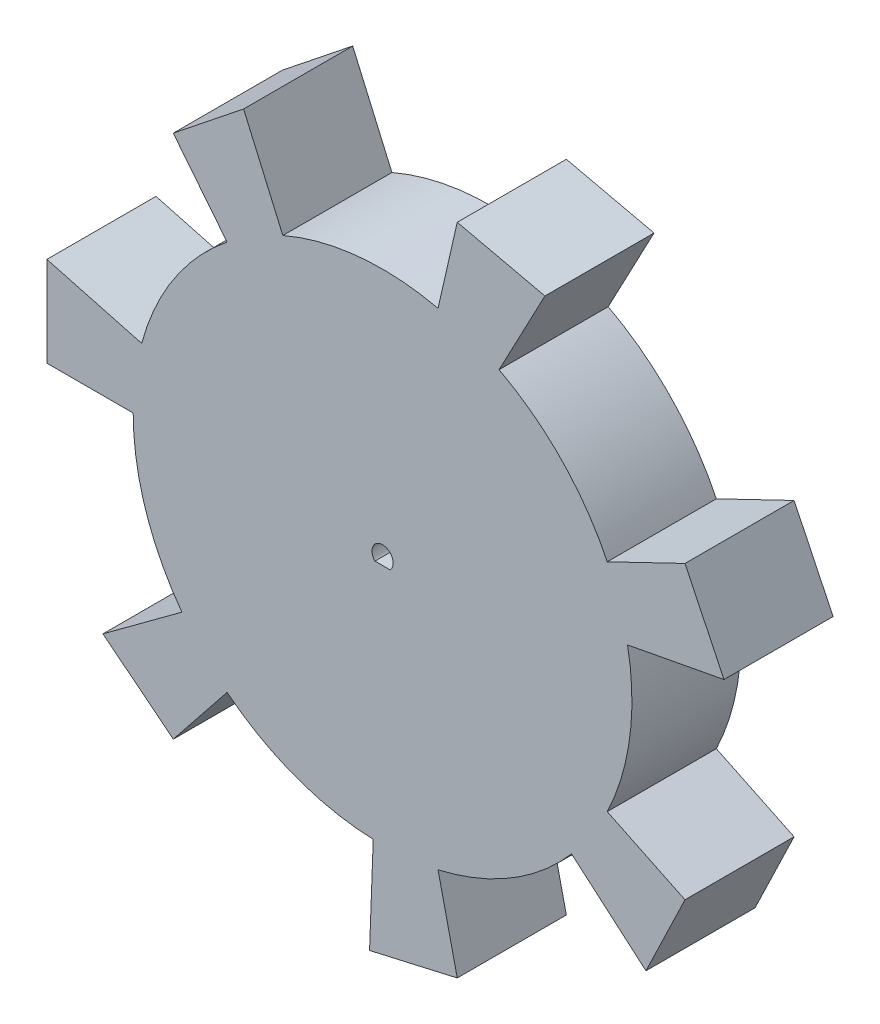
ISO-10303-21;
HEADER;
FILE_DESCRIPTION(('STEP AP214'),'2;1');
FILE_NAME('part.step','',(''),(''),'','','');
FILE_SCHEMA(('AUTOMOTIVE_DESIGN { 1 0 10303 214 1 1 1 1 }'));
ENDSEC;
DATA;
#1=APPLICATION_CONTEXT('core data for automotive mechanical design processes');
#2=APPLICATION_PROTOCOL_DEFINITION('international standard','automotive_design',2000,#1);
#3=PRODUCT_CONTEXT('',#1,'mechanical');
#4=PRODUCT('Part','Part','',(#3));
#5=PRODUCT_RELATED_PRODUCT_CATEGORY('part','',(#4));
#6=PRODUCT_DEFINITION_FORMATION('','',#4);
#7=PRODUCT_DEFINITION_CONTEXT('part definition',#1,'design');
#8=PRODUCT_DEFINITION('design','',#6,#7);
#9=PRODUCT_DEFINITION_SHAPE('','',#8);
#10=(LENGTH_UNIT() NAMED_UNIT(*) SI_UNIT(.MILLI.,.METRE.));
#11=(NAMED_UNIT(*) PLANE_ANGLE_UNIT() SI_UNIT($,.RADIAN.));
#12=(NAMED_UNIT(*) SI_UNIT($,.STERADIAN.) SOLID_ANGLE_UNIT());
#13=UNCERTAINTY_MEASURE_WITH_UNIT(LENGTH_MEASURE(1.E-05),#10,'distance_accuracy_value','');
#14=(GEOMETRIC_REPRESENTATION_CONTEXT(3) GLOBAL_UNCERTAINTY_ASSIGNED_CONTEXT((#13)) GLOBAL_UNIT_ASSIGNED_CONTEXT((#10,
#11,#12)) REPRESENTATION_CONTEXT('',''));
#15=CARTESIAN_POINT('',(0.,0.,0.));
#16=DIRECTION('',(0.,0.,1.));
#17=DIRECTION('',(1.,0.,0.));
#18=AXIS2_PLACEMENT_3D('',#15,#16,#17);
#19=CARTESIAN_POINT('',(0.,0.,17.5));
#20=DIRECTION('',(0.,0.,-1.));
#21=DIRECTION('',(-1.,0.,0.));
#22=AXIS2_PLACEMENT_3D('',#19,#20,#21);
#23=CYLINDRICAL_SURFACE('',#22,40.);
#24=CARTESIAN_POINT('',(0.,0.,0.));
#25=DIRECTION('',(0.,0.,1.));
#26=DIRECTION('',(1.,0.,0.));
#27=AXIS2_PLACEMENT_3D('',#24,#25,#26);
#28=CIRCLE('',#27,40.);
#29=CARTESIAN_POINT('',(36.0387547160991,-17.3553495647034,0.));
#30=VERTEX_POINT('',#29);
#31=CARTESIAN_POINT('',(39.3026589293317,7.43646428651689,0.));
#32=VERTEX_POINT('',#31);
#33=EDGE_CURVE('E258',#30,#32,#28,.T.);
#34=ORIENTED_EDGE('',*,*,#33,.T.);
#35=DIRECTION('',(0.,0.,-1.));
#36=VECTOR('',#35,1.);
#37=CARTESIAN_POINT('',(39.3026589293317,7.43646428651689,17.5));
#38=LINE('',#37,#36);
#39=CARTESIAN_POINT('',(39.3026589293317,7.43646428651689,17.5));
#40=VERTEX_POINT('',#39);
#41=EDGE_CURVE('E529',#40,#32,#38,.T.);
#42=ORIENTED_EDGE('',*,*,#41,.F.);
#43=CARTESIAN_POINT('',(0.,0.,17.5));
#44=DIRECTION('',(0.,0.,1.));
#45=DIRECTION('',(1.,0.,0.));
#46=AXIS2_PLACEMENT_3D('',#43,#44,#45);
#47=CIRCLE('',#46,40.);
#48=CARTESIAN_POINT('',(36.0387547160991,-17.3553495647034,17.5));
#49=VERTEX_POINT('',#48);
#50=EDGE_CURVE('E262',#49,#40,#47,.T.);
#51=ORIENTED_EDGE('',*,*,#50,.F.);
#52=DIRECTION('',(0.,0.,-1.));
#53=VECTOR('',#52,1.);
#54=CARTESIAN_POINT('',(36.0387547160991,-17.3553495647034,17.5));
#55=LINE('',#54,#53);
#56=EDGE_CURVE('E356',#49,#30,#55,.T.);
#57=ORIENTED_EDGE('',*,*,#56,.T.);
#58=EDGE_LOOP('',(#34,#42,#51,#57));
#59=FACE_BOUND('',#58,.T.);
#60=ADVANCED_FACE('F39',(#59),#23,.T.);
#61=CARTESIAN_POINT('',(0.,0.,17.5));
#62=DIRECTION('',(0.185911607162921,-0.982566473233287,0.));
#63=DIRECTION('',(0.982566473233287,0.185911607162921,0.));
#64=AXIS2_PLACEMENT_3D('',#61,#62,#63);
#65=PLANE('',#64);
#66=DIRECTION('',(-0.982566473233287,-0.185911607162921,0.));
#67=VECTOR('',#66,1.);
#68=CARTESIAN_POINT('',(0.,0.,0.));
#69=LINE('',#68,#67);
#70=CARTESIAN_POINT('',(54.7692080260714,10.3628932642804,0.));
#71=VERTEX_POINT('',#70);
#72=EDGE_CURVE('E360',#71,#32,#69,.T.);
#73=ORIENTED_EDGE('',*,*,#72,.F.);
#74=DIRECTION('',(0.,0.,-1.));
#75=VECTOR('',#74,1.);
#76=CARTESIAN_POINT('',(54.7692080260714,10.3628932642804,17.5));
#77=LINE('',#76,#75);
#78=CARTESIAN_POINT('',(54.7692080260714,10.3628932642804,17.5));
#79=VERTEX_POINT('',#78);
#80=EDGE_CURVE('E526',#79,#71,#77,.T.);
#81=ORIENTED_EDGE('',*,*,#80,.F.);
#82=DIRECTION('',(-0.982566473233287,-0.185911607162921,0.));
#83=VECTOR('',#82,1.);
#84=CARTESIAN_POINT('',(0.,0.,17.5));
#85=LINE('',#84,#83);
#86=EDGE_CURVE('E265',#79,#40,#85,.T.);
#87=ORIENTED_EDGE('',*,*,#86,.T.);
#88=ORIENTED_EDGE('',*,*,#41,.T.);
#89=EDGE_LOOP('',(#73,#81,#87,#88));
#90=FACE_BOUND('',#89,.T.);
#91=ADVANCED_FACE('F41',(#90),#65,.T.);
#92=CARTESIAN_POINT('',(48.5096434448383,23.3610130504372,17.5));
#93=DIRECTION('',(0.900968867902419,0.433883739117558,0.));
#94=DIRECTION('',(-0.433883739117559,0.900968867902419,0.));
#95=AXIS2_PLACEMENT_3D('',#92,#93,#94);
#96=PLANE('',#95);
#97=DIRECTION('',(0.433883739117559,-0.900968867902419,0.));
#98=VECTOR('',#97,1.);
#99=CARTESIAN_POINT('',(48.5096434448383,23.3610130504372,0.));
#100=LINE('',#99,#98);
#101=CARTESIAN_POINT('',(48.5096434448345,23.361013050445,0.));
#102=VERTEX_POINT('',#101);
#103=EDGE_CURVE('E366',#102,#71,#100,.T.);
#104=ORIENTED_EDGE('',*,*,#103,.F.);
#105=DIRECTION('',(0.,0.,-1.));
#106=VECTOR('',#105,1.);
#107=CARTESIAN_POINT('',(48.5096434448345,23.361013050445,17.5));
#108=LINE('',#107,#106);
#109=CARTESIAN_POINT('',(48.5096434448345,23.361013050445,17.5));
#110=VERTEX_POINT('',#109);
#111=EDGE_CURVE('E523',#110,#102,#108,.T.);
#112=ORIENTED_EDGE('',*,*,#111,.F.);
#113=DIRECTION('',(0.433883739117559,-0.900968867902419,0.));
#114=VECTOR('',#113,1.);
#115=CARTESIAN_POINT('',(48.5096434448383,23.3610130504372,17.5));
#116=LINE('',#115,#114);
#117=EDGE_CURVE('E272',#110,#79,#116,.T.);
#118=ORIENTED_EDGE('',*,*,#117,.T.);
#119=ORIENTED_EDGE('',*,*,#80,.T.);
#120=EDGE_LOOP('',(#104,#112,#118,#119));
#121=FACE_BOUND('',#120,.T.);
#122=ADVANCED_FACE('F559',(#121),#96,.T.);
#123=CARTESIAN_POINT('',(0.,0.,17.5));
#124=DIRECTION('',(-0.433883739117558,0.900968867902419,0.));
#125=DIRECTION('',(-0.900968867902419,-0.433883739117558,0.));
#126=AXIS2_PLACEMENT_3D('',#123,#124,#125);
#127=PLANE('',#126);
#128=DIRECTION('',(0.900968867902419,0.433883739117558,0.));
#129=VECTOR('',#128,1.);
#130=CARTESIAN_POINT('',(0.,0.,0.));
#131=LINE('',#130,#129);
#132=CARTESIAN_POINT('',(36.038754716097,17.3553495647024,0.));
#133=VERTEX_POINT('',#132);
#134=EDGE_CURVE('E370',#133,#102,#131,.T.);
#135=ORIENTED_EDGE('',*,*,#134,.F.);
#136=DIRECTION('',(0.,0.,-1.));
#137=VECTOR('',#136,1.);
#138=CARTESIAN_POINT('',(36.038754716097,17.3553495647024,17.5));
#139=LINE('',#138,#137);
#140=CARTESIAN_POINT('',(36.038754716097,17.3553495647024,17.5));
#141=VERTEX_POINT('',#140);
#142=EDGE_CURVE('E520',#141,#133,#139,.T.);
#143=ORIENTED_EDGE('',*,*,#142,.F.);
#144=DIRECTION('',(0.900968867902419,0.433883739117558,0.));
#145=VECTOR('',#144,1.);
#146=CARTESIAN_POINT('',(0.,0.,17.5));
#147=LINE('',#146,#145);
#148=EDGE_CURVE('E276',#141,#110,#147,.T.);
#149=ORIENTED_EDGE('',*,*,#148,.T.);
#150=ORIENTED_EDGE('',*,*,#111,.T.);
#151=EDGE_LOOP('',(#135,#143,#149,#150));
#152=FACE_BOUND('',#151,.T.);
#153=ADVANCED_FACE('F565',(#152),#127,.T.);
#154=CARTESIAN_POINT('',(18.6907451309242,35.3646157401882,0.));
#155=VERTEX_POINT('',#154);
#156=EDGE_CURVE('E362',#133,#155,#28,.T.);
#157=ORIENTED_EDGE('',*,*,#156,.T.);
#158=DIRECTION('',(0.,0.,-1.));
#159=VECTOR('',#158,1.);
#160=CARTESIAN_POINT('',(18.6907451309242,35.3646157401882,17.5));
#161=LINE('',#160,#159);
#162=CARTESIAN_POINT('',(18.6907451309242,35.3646157401882,17.5));
#163=VERTEX_POINT('',#162);
#164=EDGE_CURVE('E517',#163,#155,#161,.T.);
#165=ORIENTED_EDGE('',*,*,#164,.F.);
#166=EDGE_CURVE('E268',#141,#163,#47,.T.);
#167=ORIENTED_EDGE('',*,*,#166,.F.);
#168=ORIENTED_EDGE('',*,*,#142,.T.);
#169=EDGE_LOOP('',(#157,#165,#167,#168));
#170=FACE_BOUND('',#169,.T.);
#171=ADVANCED_FACE('F554',(#170),#23,.T.);
#172=CARTESIAN_POINT('',(0.,0.,17.5));
#173=DIRECTION('',(0.884115393504613,-0.467268628273056,0.));
#174=DIRECTION('',(0.467268628273056,0.884115393504613,0.));
#175=AXIS2_PLACEMENT_3D('',#172,#173,#174);
#176=PLANE('',#175);
#177=DIRECTION('',(-0.467268628273056,-0.884115393504613,0.));
#178=VECTOR('',#177,1.);
#179=CARTESIAN_POINT('',(0.,0.,0.));
#180=LINE('',#179,#178);
#181=CARTESIAN_POINT('',(26.046006456669,49.2814493726534,0.));
#182=VERTEX_POINT('',#181);
#183=EDGE_CURVE('E374',#182,#155,#180,.T.);
#184=ORIENTED_EDGE('',*,*,#183,.F.);
#185=DIRECTION('',(0.,0.,-1.));
#186=VECTOR('',#185,1.);
#187=CARTESIAN_POINT('',(26.046006456669,49.2814493726534,17.5));
#188=LINE('',#187,#186);
#189=CARTESIAN_POINT('',(26.046006456669,49.2814493726534,17.5));
#190=VERTEX_POINT('',#189);
#191=EDGE_CURVE('E514',#190,#182,#188,.T.);
#192=ORIENTED_EDGE('',*,*,#191,.F.);
#193=DIRECTION('',(-0.467268628273056,-0.884115393504613,0.));
#194=VECTOR('',#193,1.);
#195=CARTESIAN_POINT('',(0.,0.,17.5));
#196=LINE('',#195,#194);
#197=EDGE_CURVE('E280',#190,#163,#196,.T.);
#198=ORIENTED_EDGE('',*,*,#197,.T.);
#199=ORIENTED_EDGE('',*,*,#164,.T.);
#200=EDGE_LOOP('',(#184,#192,#198,#199));
#201=FACE_BOUND('',#200,.T.);
#202=ADVANCED_FACE('F564',(#201),#176,.T.);
#203=CARTESIAN_POINT('',(11.9808925144822,52.4917198465115,17.5));
#204=DIRECTION('',(0.222520933956315,0.974927912181824,0.));
#205=DIRECTION('',(-0.974927912181824,0.222520933956314,0.));
#206=AXIS2_PLACEMENT_3D('',#203,#204,#205);
#207=PLANE('',#206);
#208=DIRECTION('',(0.974927912181824,-0.222520933956315,0.));
#209=VECTOR('',#208,1.);
#210=CARTESIAN_POINT('',(11.9808925144822,52.4917198465115,0.));
#211=LINE('',#210,#209);
#212=CARTESIAN_POINT('',(11.9808925144776,52.4917198465125,0.));
#213=VERTEX_POINT('',#212);
#214=EDGE_CURVE('E378',#213,#182,#211,.T.);
#215=ORIENTED_EDGE('',*,*,#214,.F.);
#216=DIRECTION('',(0.,0.,-1.));
#217=VECTOR('',#216,1.);
#218=CARTESIAN_POINT('',(11.9808925144776,52.4917198465125,17.5));
#219=LINE('',#218,#217);
#220=CARTESIAN_POINT('',(11.9808925144776,52.4917198465125,17.5));
#221=VERTEX_POINT('',#220);
#222=EDGE_CURVE('E511',#221,#213,#219,.T.);
#223=ORIENTED_EDGE('',*,*,#222,.F.);
#224=DIRECTION('',(0.974927912181824,-0.222520933956315,0.));
#225=VECTOR('',#224,1.);
#226=CARTESIAN_POINT('',(11.9808925144822,52.4917198465115,17.5));
#227=LINE('',#226,#225);
#228=EDGE_CURVE('E284',#221,#190,#227,.T.);
#229=ORIENTED_EDGE('',*,*,#228,.T.);
#230=ORIENTED_EDGE('',*,*,#191,.T.);
#231=EDGE_LOOP('',(#215,#223,#229,#230));
#232=FACE_BOUND('',#231,.T.);
#233=ADVANCED_FACE('F636',(#232),#207,.T.);
#234=CARTESIAN_POINT('',(0.,0.,17.5));
#235=DIRECTION('',(-0.974927912181824,0.222520933956314,0.));
#236=DIRECTION('',(-0.222520933956314,-0.974927912181824,0.));
#237=AXIS2_PLACEMENT_3D('',#234,#235,#236);
#238=PLANE('',#237);
#239=DIRECTION('',(0.222520933956314,0.974927912181824,0.));
#240=VECTOR('',#239,1.);
#241=CARTESIAN_POINT('',(0.,0.,0.));
#242=LINE('',#241,#240);
#243=CARTESIAN_POINT('',(8.9008373582534,38.9971164872766,0.));
#244=VERTEX_POINT('',#243);
#245=EDGE_CURVE('E382',#244,#213,#242,.T.);
#246=ORIENTED_EDGE('',*,*,#245,.F.);
#247=DIRECTION('',(0.,0.,-1.));
#248=VECTOR('',#247,1.);
#249=CARTESIAN_POINT('',(8.9008373582534,38.9971164872766,17.5));
#250=LINE('',#249,#248);
#251=CARTESIAN_POINT('',(8.9008373582534,38.9971164872766,17.5));
#252=VERTEX_POINT('',#251);
#253=EDGE_CURVE('E508',#252,#244,#250,.T.);
#254=ORIENTED_EDGE('',*,*,#253,.F.);
#255=DIRECTION('',(0.222520933956314,0.974927912181824,0.));
#256=VECTOR('',#255,1.);
#257=CARTESIAN_POINT('',(0.,0.,17.5));
#258=LINE('',#257,#256);
#259=EDGE_CURVE('E288',#252,#221,#258,.T.);
#260=ORIENTED_EDGE('',*,*,#259,.T.);
#261=ORIENTED_EDGE('',*,*,#222,.T.);
#262=EDGE_LOOP('',(#246,#254,#260,#261));
#263=FACE_BOUND('',#262,.T.);
#264=ADVANCED_FACE('F628',(#263),#238,.T.);
#265=CARTESIAN_POINT('',(-15.9956809727905,36.6624902348004,0.));
#266=VERTEX_POINT('',#265);
#267=EDGE_CURVE('E386',#244,#266,#28,.T.);
#268=ORIENTED_EDGE('',*,*,#267,.T.);
#269=DIRECTION('',(0.,0.,-1.));
#270=VECTOR('',#269,1.);
#271=CARTESIAN_POINT('',(-15.9956809727905,36.6624902348004,17.5));
#272=LINE('',#271,#270);
#273=CARTESIAN_POINT('',(-15.9956809727905,36.6624902348004,17.5));
#274=VERTEX_POINT('',#273);
#275=EDGE_CURVE('E505',#274,#266,#272,.T.);
#276=ORIENTED_EDGE('',*,*,#275,.F.);
#277=EDGE_CURVE('E292',#252,#274,#47,.T.);
#278=ORIENTED_EDGE('',*,*,#277,.F.);
#279=ORIENTED_EDGE('',*,*,#253,.T.);
#280=EDGE_LOOP('',(#268,#276,#278,#279));
#281=FACE_BOUND('',#280,.T.);
#282=ADVANCED_FACE('F567',(#281),#23,.T.);
#283=CARTESIAN_POINT('',(0.,0.,17.5));
#284=DIRECTION('',(0.916562255869973,0.399892024319747,0.));
#285=DIRECTION('',(-0.399892024319747,0.916562255869974,0.));
#286=AXIS2_PLACEMENT_3D('',#283,#284,#285);
#287=PLANE('',#286);
#288=DIRECTION('',(0.399892024319747,-0.916562255869974,0.));
#289=VECTOR('',#288,1.);
#290=CARTESIAN_POINT('',(0.,0.,0.));
#291=LINE('',#290,#289);
#292=CARTESIAN_POINT('',(-22.2903692163106,51.0900689450571,0.));
#293=VERTEX_POINT('',#292);
#294=EDGE_CURVE('E387',#293,#266,#291,.T.);
#295=ORIENTED_EDGE('',*,*,#294,.F.);
#296=DIRECTION('',(0.,0.,-1.));
#297=VECTOR('',#296,1.);
#298=CARTESIAN_POINT('',(-22.2903692163106,51.0900689450571,17.5));
#299=LINE('',#298,#297);
#300=CARTESIAN_POINT('',(-22.2903692163106,51.0900689450571,17.5));
#301=VERTEX_POINT('',#300);
#302=EDGE_CURVE('E502',#301,#293,#299,.T.);
#303=ORIENTED_EDGE('',*,*,#302,.F.);
#304=DIRECTION('',(0.399892024319747,-0.916562255869974,0.));
#305=VECTOR('',#304,1.);
#306=CARTESIAN_POINT('',(0.,0.,17.5));
#307=LINE('',#306,#305);
#308=EDGE_CURVE('E293',#301,#274,#307,.T.);
#309=ORIENTED_EDGE('',*,*,#308,.T.);
#310=ORIENTED_EDGE('',*,*,#275,.T.);
#311=EDGE_LOOP('',(#295,#303,#309,#310));
#312=FACE_BOUND('',#311,.T.);
#313=ADVANCED_FACE('F627',(#312),#287,.T.);
#314=CARTESIAN_POINT('',(-33.569714844948,42.0950909622117,17.5));
#315=DIRECTION('',(-0.623489801858734,0.78183148246803,0.));
#316=DIRECTION('',(-0.78183148246803,-0.623489801858734,0.));
#317=AXIS2_PLACEMENT_3D('',#314,#315,#316);
#318=PLANE('',#317);
#319=DIRECTION('',(0.78183148246803,0.623489801858734,0.));
#320=VECTOR('',#319,1.);
#321=CARTESIAN_POINT('',(-33.569714844948,42.0950909622117,0.));
#322=LINE('',#321,#320);
#323=CARTESIAN_POINT('',(-33.5697148449486,42.0950909622112,0.));
#324=VERTEX_POINT('',#323);
#325=EDGE_CURVE('E391',#324,#293,#322,.T.);
#326=ORIENTED_EDGE('',*,*,#325,.F.);
#327=DIRECTION('',(0.,0.,-1.));
#328=VECTOR('',#327,1.);
#329=CARTESIAN_POINT('',(-33.5697148449486,42.0950909622112,17.5));
#330=LINE('',#329,#328);
#331=CARTESIAN_POINT('',(-33.5697148449486,42.0950909622112,17.5));
#332=VERTEX_POINT('',#331);
#333=EDGE_CURVE('E499',#332,#324,#330,.T.);
#334=ORIENTED_EDGE('',*,*,#333,.F.);
#335=DIRECTION('',(0.78183148246803,0.623489801858734,0.));
#336=VECTOR('',#335,1.);
#337=CARTESIAN_POINT('',(-33.569714844948,42.0950909622117,17.5));
#338=LINE('',#337,#336);
#339=EDGE_CURVE('E297',#332,#301,#338,.T.);
#340=ORIENTED_EDGE('',*,*,#339,.T.);
#341=ORIENTED_EDGE('',*,*,#302,.T.);
#342=EDGE_LOOP('',(#326,#334,#340,#341));
#343=FACE_BOUND('',#342,.T.);
#344=ADVANCED_FACE('F622',(#343),#318,.T.);
#345=CARTESIAN_POINT('',(0.,0.,17.5));
#346=DIRECTION('',(-0.78183148246803,-0.623489801858734,0.));
#347=DIRECTION('',(0.623489801858734,-0.78183148246803,0.));
#348=AXIS2_PLACEMENT_3D('',#345,#346,#347);
#349=PLANE('',#348);
#350=DIRECTION('',(-0.623489801858734,0.78183148246803,0.));
#351=VECTOR('',#350,1.);
#352=CARTESIAN_POINT('',(0.,0.,0.));
#353=LINE('',#352,#351);
#354=CARTESIAN_POINT('',(-24.9395920743505,31.2732592987226,0.));
#355=VERTEX_POINT('',#354);
#356=EDGE_CURVE('E395',#355,#324,#353,.T.);
#357=ORIENTED_EDGE('',*,*,#356,.F.);
#358=DIRECTION('',(0.,0.,-1.));
#359=VECTOR('',#358,1.);
#360=CARTESIAN_POINT('',(-24.9395920743505,31.2732592987226,17.5));
#361=LINE('',#360,#359);
#362=CARTESIAN_POINT('',(-24.9395920743505,31.2732592987226,17.5));
#363=VERTEX_POINT('',#362);
#364=EDGE_CURVE('E496',#363,#355,#361,.T.);
#365=ORIENTED_EDGE('',*,*,#364,.F.);
#366=DIRECTION('',(-0.623489801858734,0.78183148246803,0.));
#367=VECTOR('',#366,1.);
#368=CARTESIAN_POINT('',(0.,0.,17.5));
#369=LINE('',#368,#367);
#370=EDGE_CURVE('E301',#363,#332,#369,.T.);
#371=ORIENTED_EDGE('',*,*,#370,.T.);
#372=ORIENTED_EDGE('',*,*,#333,.T.);
#373=EDGE_LOOP('',(#357,#365,#371,#372));
#374=FACE_BOUND('',#373,.T.);
#375=ADVANCED_FACE('F614',(#374),#349,.T.);
#376=CARTESIAN_POINT('',(-38.6370330515628,10.3527618041006,0.));
#377=VERTEX_POINT('',#376);
#378=EDGE_CURVE('E399',#355,#377,#28,.T.);
#379=ORIENTED_EDGE('',*,*,#378,.T.);
#380=DIRECTION('',(0.,0.,-1.));
#381=VECTOR('',#380,1.);
#382=CARTESIAN_POINT('',(-38.6370330515628,10.3527618041006,17.5));
#383=LINE('',#382,#381);
#384=CARTESIAN_POINT('',(-38.6370330515628,10.3527618041006,17.5));
#385=VERTEX_POINT('',#384);
#386=EDGE_CURVE('E493',#385,#377,#383,.T.);
#387=ORIENTED_EDGE('',*,*,#386,.F.);
#388=EDGE_CURVE('E305',#363,#385,#47,.T.);
#389=ORIENTED_EDGE('',*,*,#388,.F.);
#390=ORIENTED_EDGE('',*,*,#364,.T.);
#391=EDGE_LOOP('',(#379,#387,#389,#390));
#392=FACE_BOUND('',#391,.T.);
#393=ADVANCED_FACE('F601',(#392),#23,.T.);
#394=CARTESIAN_POINT('',(0.,0.,17.5));
#395=DIRECTION('',(0.258819045102514,0.96592582628907,0.));
#396=DIRECTION('',(-0.96592582628907,0.258819045102514,0.));
#397=AXIS2_PLACEMENT_3D('',#394,#395,#396);
#398=PLANE('',#397);
#399=DIRECTION('',(0.96592582628907,-0.258819045102514,0.));
#400=VECTOR('',#399,1.);
#401=CARTESIAN_POINT('',(0.,0.,0.));
#402=LINE('',#401,#400);
#403=CARTESIAN_POINT('',(-53.841642228739,14.4268245543557,0.));
#404=VERTEX_POINT('',#403);
#405=EDGE_CURVE('E400',#404,#377,#402,.T.);
#406=ORIENTED_EDGE('',*,*,#405,.F.);
#407=DIRECTION('',(0.,0.,-1.));
#408=VECTOR('',#407,1.);
#409=CARTESIAN_POINT('',(-53.841642228739,14.4268245543557,17.5));
#410=LINE('',#409,#408);
#411=CARTESIAN_POINT('',(-53.841642228739,14.4268245543557,17.5));
#412=VERTEX_POINT('',#411);
#413=EDGE_CURVE('E490',#412,#404,#410,.T.);
#414=ORIENTED_EDGE('',*,*,#413,.F.);
#415=DIRECTION('',(0.96592582628907,-0.258819045102514,0.));
#416=VECTOR('',#415,1.);
#417=CARTESIAN_POINT('',(0.,0.,17.5));
#418=LINE('',#417,#416);
#419=EDGE_CURVE('E306',#412,#385,#418,.T.);
#420=ORIENTED_EDGE('',*,*,#419,.T.);
#421=ORIENTED_EDGE('',*,*,#386,.T.);
#422=EDGE_LOOP('',(#406,#414,#420,#421));
#423=FACE_BOUND('',#422,.T.);
#424=ADVANCED_FACE('F613',(#423),#398,.T.);
#425=CARTESIAN_POINT('',(-53.841642228739,0.,17.5));
#426=DIRECTION('',(-1.,0.,0.));
#427=DIRECTION('',(0.,0.,1.));
#428=AXIS2_PLACEMENT_3D('',#425,#426,#427);
#429=PLANE('',#428);
#430=DIRECTION('',(0.,1.,0.));
#431=VECTOR('',#430,1.);
#432=CARTESIAN_POINT('',(-53.841642228739,0.,0.));
#433=LINE('',#432,#431);
#434=CARTESIAN_POINT('',(-53.841642228739,0.,0.));
#435=VERTEX_POINT('',#434);
#436=EDGE_CURVE('E404',#435,#404,#433,.T.);
#437=ORIENTED_EDGE('',*,*,#436,.F.);
#438=DIRECTION('',(0.,0.,-1.));
#439=VECTOR('',#438,1.);
#440=CARTESIAN_POINT('',(-53.841642228739,0.,17.5));
#441=LINE('',#440,#439);
#442=CARTESIAN_POINT('',(-53.841642228739,0.,17.5));
#443=VERTEX_POINT('',#442);
#444=EDGE_CURVE('E487',#443,#435,#441,.T.);
#445=ORIENTED_EDGE('',*,*,#444,.F.);
#446=DIRECTION('',(0.,1.,0.));
#447=VECTOR('',#446,1.);
#448=CARTESIAN_POINT('',(-53.841642228739,0.,17.5));
#449=LINE('',#448,#447);
#450=EDGE_CURVE('E310',#443,#412,#449,.T.);
#451=ORIENTED_EDGE('',*,*,#450,.T.);
#452=ORIENTED_EDGE('',*,*,#413,.T.);
#453=EDGE_LOOP('',(#437,#445,#451,#452));
#454=FACE_BOUND('',#453,.T.);
#455=ADVANCED_FACE('F608',(#454),#429,.T.);
#456=CARTESIAN_POINT('',(0.,0.,17.5));
#457=DIRECTION('',(0.,-1.,0.));
#458=DIRECTION('',(0.,0.,-1.));
#459=AXIS2_PLACEMENT_3D('',#456,#457,#458);
#460=PLANE('',#459);
#461=DIRECTION('',(-1.,0.,0.));
#462=VECTOR('',#461,1.);
#463=CARTESIAN_POINT('',(0.,0.,0.));
#464=LINE('',#463,#462);
#465=CARTESIAN_POINT('',(-40.,0.,0.));
#466=VERTEX_POINT('',#465);
#467=EDGE_CURVE('E408',#466,#435,#464,.T.);
#468=ORIENTED_EDGE('',*,*,#467,.F.);
#469=DIRECTION('',(0.,0.,-1.));
#470=VECTOR('',#469,1.);
#471=CARTESIAN_POINT('',(-40.,0.,17.5));
#472=LINE('',#471,#470);
#473=CARTESIAN_POINT('',(-40.,0.,17.5));
#474=VERTEX_POINT('',#473);
#475=EDGE_CURVE('E484',#474,#466,#472,.T.);
#476=ORIENTED_EDGE('',*,*,#475,.F.);
#477=DIRECTION('',(-1.,0.,0.));
#478=VECTOR('',#477,1.);
#479=CARTESIAN_POINT('',(0.,0.,17.5));
#480=LINE('',#479,#478);
#481=EDGE_CURVE('E314',#474,#443,#480,.T.);
#482=ORIENTED_EDGE('',*,*,#481,.T.);
#483=ORIENTED_EDGE('',*,*,#444,.T.);
#484=EDGE_LOOP('',(#468,#476,#482,#483));
#485=FACE_BOUND('',#484,.T.);
#486=ADVANCED_FACE('F599',(#485),#460,.T.);
#487=CARTESIAN_POINT('',(-32.1839111906644,-23.7528074229387,0.));
#488=VERTEX_POINT('',#487);
#489=EDGE_CURVE('E412',#466,#488,#28,.T.);
#490=ORIENTED_EDGE('',*,*,#489,.T.);
#491=DIRECTION('',(0.,0.,-1.));
#492=VECTOR('',#491,1.);
#493=CARTESIAN_POINT('',(-32.1839111906644,-23.7528074229387,17.5));
#494=LINE('',#493,#492);
#495=CARTESIAN_POINT('',(-32.1839111906644,-23.7528074229387,17.5));
#496=VERTEX_POINT('',#495);
#497=EDGE_CURVE('E481',#496,#488,#494,.T.);
#498=ORIENTED_EDGE('',*,*,#497,.F.);
#499=EDGE_CURVE('E318',#474,#496,#47,.T.);
#500=ORIENTED_EDGE('',*,*,#499,.F.);
#501=ORIENTED_EDGE('',*,*,#475,.T.);
#502=EDGE_LOOP('',(#490,#498,#500,#501));
#503=FACE_BOUND('',#502,.T.);
#504=ADVANCED_FACE('F586',(#503),#23,.T.);
#505=CARTESIAN_POINT('',(0.,0.,17.5));
#506=DIRECTION('',(-0.593820185573507,0.804597779766665,0.));
#507=DIRECTION('',(-0.804597779766665,-0.593820185573507,0.));
#508=AXIS2_PLACEMENT_3D('',#505,#506,#507);
#509=PLANE('',#508);
#510=DIRECTION('',(0.804597779766664,0.593820185573507,0.));
#511=VECTOR('',#510,1.);
#512=CARTESIAN_POINT('',(0.,0.,0.));
#513=LINE('',#512,#511);
#514=CARTESIAN_POINT('',(-44.849060473579,-33.1001129793616,0.));
#515=VERTEX_POINT('',#514);
#516=EDGE_CURVE('E413',#515,#488,#513,.T.);
#517=ORIENTED_EDGE('',*,*,#516,.F.);
#518=DIRECTION('',(0.,0.,-1.));
#519=VECTOR('',#518,1.);
#520=CARTESIAN_POINT('',(-44.849060473579,-33.1001129793616,17.5));
#521=LINE('',#520,#519);
#522=CARTESIAN_POINT('',(-44.849060473579,-33.1001129793616,17.5));
#523=VERTEX_POINT('',#522);
#524=EDGE_CURVE('E478',#523,#515,#521,.T.);
#525=ORIENTED_EDGE('',*,*,#524,.F.);
#526=DIRECTION('',(0.804597779766664,0.593820185573507,0.));
#527=VECTOR('',#526,1.);
#528=CARTESIAN_POINT('',(0.,0.,17.5));
#529=LINE('',#528,#527);
#530=EDGE_CURVE('E319',#523,#496,#529,.T.);
#531=ORIENTED_EDGE('',*,*,#530,.T.);
#532=ORIENTED_EDGE('',*,*,#497,.T.);
#533=EDGE_LOOP('',(#517,#525,#531,#532));
#534=FACE_BOUND('',#533,.T.);
#535=ADVANCED_FACE('F598',(#534),#509,.T.);
#536=CARTESIAN_POINT('',(-33.5697148449432,-42.0950909622057,17.5));
#537=DIRECTION('',(-0.623489801858734,-0.78183148246803,0.));
#538=DIRECTION('',(0.78183148246803,-0.623489801858734,0.));
#539=AXIS2_PLACEMENT_3D('',#536,#537,#538);
#540=PLANE('',#539);
#541=DIRECTION('',(-0.78183148246803,0.623489801858734,0.));
#542=VECTOR('',#541,1.);
#543=CARTESIAN_POINT('',(-33.5697148449432,-42.0950909622057,0.));
#544=LINE('',#543,#542);
#545=CARTESIAN_POINT('',(-33.5697148449409,-42.0950909622075,0.));
#546=VERTEX_POINT('',#545);
#547=EDGE_CURVE('E417',#546,#515,#544,.T.);
#548=ORIENTED_EDGE('',*,*,#547,.F.);
#549=DIRECTION('',(0.,0.,-1.));
#550=VECTOR('',#549,1.);
#551=CARTESIAN_POINT('',(-33.5697148449409,-42.0950909622075,17.5));
#552=LINE('',#551,#550);
#553=CARTESIAN_POINT('',(-33.5697148449409,-42.0950909622075,17.5));
#554=VERTEX_POINT('',#553);
#555=EDGE_CURVE('E475',#554,#546,#552,.T.);
#556=ORIENTED_EDGE('',*,*,#555,.F.);
#557=DIRECTION('',(-0.78183148246803,0.623489801858734,0.));
#558=VECTOR('',#557,1.);
#559=CARTESIAN_POINT('',(-33.5697148449432,-42.0950909622057,17.5));
#560=LINE('',#559,#558);
#561=EDGE_CURVE('E323',#554,#523,#560,.T.);
#562=ORIENTED_EDGE('',*,*,#561,.T.);
#563=ORIENTED_EDGE('',*,*,#524,.T.);
#564=EDGE_LOOP('',(#548,#556,#562,#563));
#565=FACE_BOUND('',#564,.T.);
#566=ADVANCED_FACE('F593',(#565),#540,.T.);
#567=CARTESIAN_POINT('',(0.,0.,17.5));
#568=DIRECTION('',(0.78183148246803,-0.623489801858733,0.));
#569=DIRECTION('',(0.623489801858734,0.78183148246803,0.));
#570=AXIS2_PLACEMENT_3D('',#567,#568,#569);
#571=PLANE('',#570);
#572=DIRECTION('',(-0.623489801858734,-0.78183148246803,0.));
#573=VECTOR('',#572,1.);
#574=CARTESIAN_POINT('',(0.,0.,0.));
#575=LINE('',#574,#573);
#576=CARTESIAN_POINT('',(-24.939592074349,-31.2732592987208,0.));
#577=VERTEX_POINT('',#576);
#578=EDGE_CURVE('E421',#577,#546,#575,.T.);
#579=ORIENTED_EDGE('',*,*,#578,.F.);
#580=DIRECTION('',(0.,0.,-1.));
#581=VECTOR('',#580,1.);
#582=CARTESIAN_POINT('',(-24.939592074349,-31.2732592987208,17.5));
#583=LINE('',#582,#581);
#584=CARTESIAN_POINT('',(-24.939592074349,-31.2732592987208,17.5));
#585=VERTEX_POINT('',#584);
#586=EDGE_CURVE('E472',#585,#577,#583,.T.);
#587=ORIENTED_EDGE('',*,*,#586,.F.);
#588=DIRECTION('',(-0.623489801858734,-0.78183148246803,0.));
#589=VECTOR('',#588,1.);
#590=CARTESIAN_POINT('',(0.,0.,17.5));
#591=LINE('',#590,#589);
#592=EDGE_CURVE('E327',#585,#554,#591,.T.);
#593=ORIENTED_EDGE('',*,*,#592,.T.);
#594=ORIENTED_EDGE('',*,*,#555,.T.);
#595=EDGE_LOOP('',(#579,#587,#593,#594));
#596=FACE_BOUND('',#595,.T.);
#597=ADVANCED_FACE('F584',(#596),#571,.T.);
#598=CARTESIAN_POINT('',(-1.49564777105266,-39.9720281915336,0.));
#599=VERTEX_POINT('',#598);
#600=EDGE_CURVE('E425',#577,#599,#28,.T.);
#601=ORIENTED_EDGE('',*,*,#600,.T.);
#602=DIRECTION('',(0.,0.,-1.));
#603=VECTOR('',#602,1.);
#604=CARTESIAN_POINT('',(-1.49564777105266,-39.9720281915336,17.5));
#605=LINE('',#604,#603);
#606=CARTESIAN_POINT('',(-1.49564777105266,-39.9720281915336,17.5));
#607=VERTEX_POINT('',#606);
#608=EDGE_CURVE('E469',#607,#599,#605,.T.);
#609=ORIENTED_EDGE('',*,*,#608,.F.);
#610=EDGE_CURVE('E331',#585,#607,#47,.T.);
#611=ORIENTED_EDGE('',*,*,#610,.F.);
#612=ORIENTED_EDGE('',*,*,#586,.T.);
#613=EDGE_LOOP('',(#601,#609,#611,#612));
#614=FACE_BOUND('',#613,.T.);
#615=ADVANCED_FACE('F572',(#614),#23,.T.);
#616=CARTESIAN_POINT('',(0.,0.,17.5));
#617=DIRECTION('',(-0.999300704788399,0.0373911942763188,0.));
#618=DIRECTION('',(-0.0373911942763188,-0.999300704788399,0.));
#619=AXIS2_PLACEMENT_3D('',#616,#617,#618);
#620=PLANE('',#619);
#621=DIRECTION('',(0.0373911942763188,0.999300704788399,0.));
#622=VECTOR('',#621,1.);
#623=CARTESIAN_POINT('',(0.,0.,0.));
#624=LINE('',#623,#622);
#625=CARTESIAN_POINT('',(-2.08422142770423,-55.7019903203597,0.));
#626=VERTEX_POINT('',#625);
#627=EDGE_CURVE('E426',#626,#599,#624,.T.);
#628=ORIENTED_EDGE('',*,*,#627,.F.);
#629=DIRECTION('',(0.,0.,-1.));
#630=VECTOR('',#629,1.);
#631=CARTESIAN_POINT('',(-2.08422142770423,-55.7019903203597,17.5));
#632=LINE('',#631,#630);
#633=CARTESIAN_POINT('',(-2.08422142770423,-55.7019903203597,17.5));
#634=VERTEX_POINT('',#633);
#635=EDGE_CURVE('E466',#634,#626,#632,.T.);
#636=ORIENTED_EDGE('',*,*,#635,.F.);
#637=DIRECTION('',(0.0373911942763188,0.999300704788399,0.));
#638=VECTOR('',#637,1.);
#639=CARTESIAN_POINT('',(0.,0.,17.5));
#640=LINE('',#639,#638);
#641=EDGE_CURVE('E332',#634,#607,#640,.T.);
#642=ORIENTED_EDGE('',*,*,#641,.T.);
#643=ORIENTED_EDGE('',*,*,#608,.T.);
#644=EDGE_LOOP('',(#628,#636,#642,#643));
#645=FACE_BOUND('',#644,.T.);
#646=ADVANCED_FACE('F583',(#645),#620,.T.);
#647=CARTESIAN_POINT('',(11.98089251448,-52.4917198465022,17.5));
#648=DIRECTION('',(0.222520933956315,-0.974927912181824,0.));
#649=DIRECTION('',(0.974927912181824,0.222520933956314,0.));
#650=AXIS2_PLACEMENT_3D('',#647,#648,#649);
#651=PLANE('',#650);
#652=DIRECTION('',(-0.974927912181824,-0.222520933956315,0.));
#653=VECTOR('',#652,1.);
#654=CARTESIAN_POINT('',(11.98089251448,-52.4917198465022,0.));
#655=LINE('',#654,#653);
#656=CARTESIAN_POINT('',(11.9808925144872,-52.4917198465005,0.));
#657=VERTEX_POINT('',#656);
#658=EDGE_CURVE('E430',#657,#626,#655,.T.);
#659=ORIENTED_EDGE('',*,*,#658,.F.);
#660=DIRECTION('',(0.,0.,-1.));
#661=VECTOR('',#660,1.);
#662=CARTESIAN_POINT('',(11.9808925144872,-52.4917198465005,17.5));
#663=LINE('',#662,#661);
#664=CARTESIAN_POINT('',(11.9808925144872,-52.4917198465005,17.5));
#665=VERTEX_POINT('',#664);
#666=EDGE_CURVE('E463',#665,#657,#663,.T.);
#667=ORIENTED_EDGE('',*,*,#666,.F.);
#668=DIRECTION('',(-0.974927912181824,-0.222520933956315,0.));
#669=VECTOR('',#668,1.);
#670=CARTESIAN_POINT('',(11.98089251448,-52.4917198465022,17.5));
#671=LINE('',#670,#669);
#672=EDGE_CURVE('E336',#665,#634,#671,.T.);
#673=ORIENTED_EDGE('',*,*,#672,.T.);
#674=ORIENTED_EDGE('',*,*,#635,.T.);
#675=EDGE_LOOP('',(#659,#667,#673,#674));
#676=FACE_BOUND('',#675,.T.);
#677=ADVANCED_FACE('F579',(#676),#651,.T.);
#678=CARTESIAN_POINT('',(0.,0.,17.5));
#679=DIRECTION('',(0.974927912181824,0.222520933956315,0.));
#680=DIRECTION('',(-0.222520933956315,0.974927912181824,0.));
#681=AXIS2_PLACEMENT_3D('',#678,#679,#680);
#682=PLANE('',#681);
#683=DIRECTION('',(0.222520933956315,-0.974927912181824,0.));
#684=VECTOR('',#683,1.);
#685=CARTESIAN_POINT('',(0.,0.,0.));
#686=LINE('',#685,#684);
#687=CARTESIAN_POINT('',(8.90083735825205,-38.9971164872706,0.));
#688=VERTEX_POINT('',#687);
#689=EDGE_CURVE('E434',#688,#657,#686,.T.);
#690=ORIENTED_EDGE('',*,*,#689,.F.);
#691=DIRECTION('',(0.,0.,-1.));
#692=VECTOR('',#691,1.);
#693=CARTESIAN_POINT('',(8.90083735825205,-38.9971164872706,17.5));
#694=LINE('',#693,#692);
#695=CARTESIAN_POINT('',(8.90083735825205,-38.9971164872706,17.5));
#696=VERTEX_POINT('',#695);
#697=EDGE_CURVE('E460',#696,#688,#694,.T.);
#698=ORIENTED_EDGE('',*,*,#697,.F.);
#699=DIRECTION('',(0.222520933956315,-0.974927912181824,0.));
#700=VECTOR('',#699,1.);
#701=CARTESIAN_POINT('',(0.,0.,17.5));
#702=LINE('',#701,#700);
#703=EDGE_CURVE('E340',#696,#665,#702,.T.);
#704=ORIENTED_EDGE('',*,*,#703,.T.);
#705=ORIENTED_EDGE('',*,*,#666,.T.);
#706=EDGE_LOOP('',(#690,#698,#704,#705));
#707=FACE_BOUND('',#706,.T.);
#708=ADVANCED_FACE('F570',(#707),#682,.T.);
#709=CARTESIAN_POINT('',(30.3188689258206,-26.0914964511267,0.));
#710=VERTEX_POINT('',#709);
#711=EDGE_CURVE('E361',#688,#710,#28,.T.);
#712=ORIENTED_EDGE('',*,*,#711,.T.);
#713=DIRECTION('',(0.,0.,-1.));
#714=VECTOR('',#713,1.);
#715=CARTESIAN_POINT('',(30.3188689258206,-26.0914964511267,17.5));
#716=LINE('',#715,#714);
#717=CARTESIAN_POINT('',(30.3188689258206,-26.0914964511267,17.5));
#718=VERTEX_POINT('',#717);
#719=EDGE_CURVE('E457',#718,#710,#716,.T.);
#720=ORIENTED_EDGE('',*,*,#719,.F.);
#721=EDGE_CURVE('E267',#696,#718,#47,.T.);
#722=ORIENTED_EDGE('',*,*,#721,.F.);
#723=ORIENTED_EDGE('',*,*,#697,.T.);
#724=EDGE_LOOP('',(#712,#720,#722,#723));
#725=FACE_BOUND('',#724,.T.);
#726=ADVANCED_FACE('F555',(#725),#23,.T.);
#727=CARTESIAN_POINT('',(0.,0.,17.5));
#728=DIRECTION('',(-0.652287411278116,-0.757971723145457,0.));
#729=DIRECTION('',(0.757971723145457,-0.652287411278116,0.));
#730=AXIS2_PLACEMENT_3D('',#727,#728,#729);
#731=PLANE('',#730);
#732=DIRECTION('',(-0.757971723145457,0.652287411278116,0.));
#733=VECTOR('',#732,1.);
#734=CARTESIAN_POINT('',(0.,0.,0.));
#735=LINE('',#734,#733);
#736=CARTESIAN_POINT('',(42.2500788636019,-36.359132836591,0.));
#737=VERTEX_POINT('',#736);
#738=EDGE_CURVE('E438',#737,#710,#735,.T.);
#739=ORIENTED_EDGE('',*,*,#738,.F.);
#740=DIRECTION('',(0.,0.,-1.));
#741=VECTOR('',#740,1.);
#742=CARTESIAN_POINT('',(42.2500788636019,-36.359132836591,17.5));
#743=LINE('',#742,#741);
#744=CARTESIAN_POINT('',(42.2500788636019,-36.359132836591,17.5));
#745=VERTEX_POINT('',#744);
#746=EDGE_CURVE('E454',#745,#737,#743,.T.);
#747=ORIENTED_EDGE('',*,*,#746,.F.);
#748=DIRECTION('',(-0.757971723145457,0.652287411278116,0.));
#749=VECTOR('',#748,1.);
#750=CARTESIAN_POINT('',(0.,0.,17.5));
#751=LINE('',#750,#749);
#752=EDGE_CURVE('E344',#745,#718,#751,.T.);
#753=ORIENTED_EDGE('',*,*,#752,.T.);
#754=ORIENTED_EDGE('',*,*,#719,.T.);
#755=EDGE_LOOP('',(#739,#747,#753,#754));
#756=FACE_BOUND('',#755,.T.);
#757=ADVANCED_FACE('F569',(#756),#731,.T.);
#758=CARTESIAN_POINT('',(48.5096434448345,-23.3610130504353,17.5));
#759=DIRECTION('',(0.900968867902419,-0.433883739117558,0.));
#760=DIRECTION('',(0.433883739117558,0.900968867902419,0.));
#761=AXIS2_PLACEMENT_3D('',#758,#759,#760);
#762=PLANE('',#761);
#763=DIRECTION('',(-0.433883739117558,-0.900968867902419,0.));
#764=VECTOR('',#763,1.);
#765=CARTESIAN_POINT('',(48.5096434448345,-23.3610130504353,0.));
#766=LINE('',#765,#764);
#767=CARTESIAN_POINT('',(48.5096434448388,-23.3610130504263,0.));
#768=VERTEX_POINT('',#767);
#769=EDGE_CURVE('E442',#768,#737,#766,.T.);
#770=ORIENTED_EDGE('',*,*,#769,.F.);
#771=DIRECTION('',(0.,0.,-1.));
#772=VECTOR('',#771,1.);
#773=CARTESIAN_POINT('',(48.5096434448388,-23.3610130504263,17.5));
#774=LINE('',#773,#772);
#775=CARTESIAN_POINT('',(48.5096434448388,-23.3610130504263,17.5));
#776=VERTEX_POINT('',#775);
#777=EDGE_CURVE('E451',#776,#768,#774,.T.);
#778=ORIENTED_EDGE('',*,*,#777,.F.);
#779=DIRECTION('',(-0.433883739117558,-0.900968867902419,0.));
#780=VECTOR('',#779,1.);
#781=CARTESIAN_POINT('',(48.5096434448345,-23.3610130504353,17.5));
#782=LINE('',#781,#780);
#783=EDGE_CURVE('E348',#776,#745,#782,.T.);
#784=ORIENTED_EDGE('',*,*,#783,.T.);
#785=ORIENTED_EDGE('',*,*,#746,.T.);
#786=EDGE_LOOP('',(#770,#778,#784,#785));
#787=FACE_BOUND('',#786,.T.);
#788=ADVANCED_FACE('F577',(#787),#762,.T.);
#789=CARTESIAN_POINT('',(0.,0.,17.5));
#790=DIRECTION('',(0.433883739117558,0.900968867902419,0.));
#791=DIRECTION('',(-0.900968867902419,0.433883739117558,0.));
#792=AXIS2_PLACEMENT_3D('',#789,#790,#791);
#793=PLANE('',#792);
#794=DIRECTION('',(0.900968867902419,-0.433883739117558,0.));
#795=VECTOR('',#794,1.);
#796=CARTESIAN_POINT('',(0.,0.,0.));
#797=LINE('',#796,#795);
#798=EDGE_CURVE('E266',#30,#768,#797,.T.);
#799=ORIENTED_EDGE('',*,*,#798,.F.);
#800=ORIENTED_EDGE('',*,*,#56,.F.);
#801=DIRECTION('',(0.900968867902419,-0.433883739117558,0.));
#802=VECTOR('',#801,1.);
#803=CARTESIAN_POINT('',(0.,0.,17.5));
#804=LINE('',#803,#802);
#805=EDGE_CURVE('E352',#49,#776,#804,.T.);
#806=ORIENTED_EDGE('',*,*,#805,.T.);
#807=ORIENTED_EDGE('',*,*,#777,.T.);
#808=EDGE_LOOP('',(#799,#800,#806,#807));
#809=FACE_BOUND('',#808,.T.);
#810=ADVANCED_FACE('F690',(#809),#793,.T.);
#811=CARTESIAN_POINT('',(0.,0.,17.5));
#812=DIRECTION('',(0.,0.,1.));
#813=DIRECTION('',(1.,0.,0.));
#814=AXIS2_PLACEMENT_3D('',#811,#812,#813);
#815=PLANE('',#814);
#816=CARTESIAN_POINT('',(0.,0.,17.5));
#817=DIRECTION('',(0.,0.,-1.));
#818=DIRECTION('',(-1.,0.,0.));
#819=AXIS2_PLACEMENT_3D('',#816,#817,#818);
#820=CIRCLE('',#819,1.7);
#821=CARTESIAN_POINT('',(-1.22376468326227,-1.18,17.5));
#822=VERTEX_POINT('',#821);
#823=CARTESIAN_POINT('',(1.22376468326227,-1.18,17.5));
#824=VERTEX_POINT('',#823);
#825=EDGE_CURVE('E55',#822,#824,#820,.T.);
#826=ORIENTED_EDGE('',*,*,#825,.T.);
#827=DIRECTION('',(-1.,0.,0.));
#828=VECTOR('',#827,1.);
#829=CARTESIAN_POINT('',(1.22376468326227,-1.18,17.5));
#830=LINE('',#829,#828);
#831=EDGE_CURVE('E239',#824,#822,#830,.T.);
#832=ORIENTED_EDGE('',*,*,#831,.T.);
#833=EDGE_LOOP('',(#826,#832));
#834=FACE_BOUND('',#833,.T.);
#835=ORIENTED_EDGE('',*,*,#50,.T.);
#836=ORIENTED_EDGE('',*,*,#86,.F.);
#837=ORIENTED_EDGE('',*,*,#117,.F.);
#838=ORIENTED_EDGE('',*,*,#148,.F.);
#839=ORIENTED_EDGE('',*,*,#166,.T.);
#840=ORIENTED_EDGE('',*,*,#197,.F.);
#841=ORIENTED_EDGE('',*,*,#228,.F.);
#842=ORIENTED_EDGE('',*,*,#259,.F.);
#843=ORIENTED_EDGE('',*,*,#277,.T.);
#844=ORIENTED_EDGE('',*,*,#308,.F.);
#845=ORIENTED_EDGE('',*,*,#339,.F.);
#846=ORIENTED_EDGE('',*,*,#370,.F.);
#847=ORIENTED_EDGE('',*,*,#388,.T.);
#848=ORIENTED_EDGE('',*,*,#419,.F.);
#849=ORIENTED_EDGE('',*,*,#450,.F.);
#850=ORIENTED_EDGE('',*,*,#481,.F.);
#851=ORIENTED_EDGE('',*,*,#499,.T.);
#852=ORIENTED_EDGE('',*,*,#530,.F.);
#853=ORIENTED_EDGE('',*,*,#561,.F.);
#854=ORIENTED_EDGE('',*,*,#592,.F.);
#855=ORIENTED_EDGE('',*,*,#610,.T.);
#856=ORIENTED_EDGE('',*,*,#641,.F.);
#857=ORIENTED_EDGE('',*,*,#672,.F.);
#858=ORIENTED_EDGE('',*,*,#703,.F.);
#859=ORIENTED_EDGE('',*,*,#721,.T.);
#860=ORIENTED_EDGE('',*,*,#752,.F.);
#861=ORIENTED_EDGE('',*,*,#783,.F.);
#862=ORIENTED_EDGE('',*,*,#805,.F.);
#863=EDGE_LOOP('',(#835,#836,#837,#838,#839,#840,#841,#842,#843,#844,#845,#846,#847,#848,#849,
#850,#851,#852,#853,#854,#855,#856,#857,#858,#859,#860,#861,#862));
#864=FACE_BOUND('',#863,.T.);
#865=ADVANCED_FACE('F246',(#834,#864),#815,.T.);
#866=CARTESIAN_POINT('',(0.,0.,0.));
#867=DIRECTION('',(0.,0.,1.));
#868=DIRECTION('',(1.,0.,0.));
#869=AXIS2_PLACEMENT_3D('',#866,#867,#868);
#870=PLANE('',#869);
#871=CARTESIAN_POINT('',(0.,0.,0.));
#872=DIRECTION('',(0.,0.,1.));
#873=DIRECTION('',(1.,0.,0.));
#874=AXIS2_PLACEMENT_3D('',#871,#872,#873);
#875=CIRCLE('',#874,30.);
#876=CARTESIAN_POINT('',(30.,0.,0.));
#877=VERTEX_POINT('',#876);
#878=EDGE_CURVE('E252',#877,#877,#875,.T.);
#879=ORIENTED_EDGE('',*,*,#878,.T.);
#880=EDGE_LOOP('',(#879));
#881=FACE_BOUND('',#880,.T.);
#882=ORIENTED_EDGE('',*,*,#33,.F.);
#883=ORIENTED_EDGE('',*,*,#798,.T.);
#884=ORIENTED_EDGE('',*,*,#769,.T.);
#885=ORIENTED_EDGE('',*,*,#738,.T.);
#886=ORIENTED_EDGE('',*,*,#711,.F.);
#887=ORIENTED_EDGE('',*,*,#689,.T.);
#888=ORIENTED_EDGE('',*,*,#658,.T.);
#889=ORIENTED_EDGE('',*,*,#627,.T.);
#890=ORIENTED_EDGE('',*,*,#600,.F.);
#891=ORIENTED_EDGE('',*,*,#578,.T.);
#892=ORIENTED_EDGE('',*,*,#547,.T.);
#893=ORIENTED_EDGE('',*,*,#516,.T.);
#894=ORIENTED_EDGE('',*,*,#489,.F.);
#895=ORIENTED_EDGE('',*,*,#467,.T.);
#896=ORIENTED_EDGE('',*,*,#436,.T.);
#897=ORIENTED_EDGE('',*,*,#405,.T.);
#898=ORIENTED_EDGE('',*,*,#378,.F.);
#899=ORIENTED_EDGE('',*,*,#356,.T.);
#900=ORIENTED_EDGE('',*,*,#325,.T.);
#901=ORIENTED_EDGE('',*,*,#294,.T.);
#902=ORIENTED_EDGE('',*,*,#267,.F.);
#903=ORIENTED_EDGE('',*,*,#245,.T.);
#904=ORIENTED_EDGE('',*,*,#214,.T.);
#905=ORIENTED_EDGE('',*,*,#183,.T.);
#906=ORIENTED_EDGE('',*,*,#156,.F.);
#907=ORIENTED_EDGE('',*,*,#134,.T.);
#908=ORIENTED_EDGE('',*,*,#103,.T.);
#909=ORIENTED_EDGE('',*,*,#72,.T.);
#910=EDGE_LOOP('',(#882,#883,#884,#885,#886,#887,#888,#889,#890,#891,#892,#893,#894,#895,#896,
#897,#898,#899,#900,#901,#902,#903,#904,#905,#906,#907,#908,#909));
#911=FACE_BOUND('',#910,.T.);
#912=ADVANCED_FACE('F541',(#881,#911),#870,.F.);
#913=CARTESIAN_POINT('',(0.,0.,17.5));
#914=DIRECTION('',(0.,0.,-1.));
#915=DIRECTION('',(-1.,0.,0.));
#916=AXIS2_PLACEMENT_3D('',#913,#914,#915);
#917=CYLINDRICAL_SURFACE('',#916,30.);
#918=ORIENTED_EDGE('',*,*,#878,.F.);
#919=EDGE_LOOP('',(#918));
#920=FACE_BOUND('',#919,.T.);
#921=CARTESIAN_POINT('',(0.,0.,7.5));
#922=DIRECTION('',(0.,0.,1.));
#923=DIRECTION('',(1.,0.,0.));
#924=AXIS2_PLACEMENT_3D('',#921,#922,#923);
#925=CIRCLE('',#924,30.);
#926=CARTESIAN_POINT('',(30.,0.,7.5));
#927=VERTEX_POINT('',#926);
#928=EDGE_CURVE('E254',#927,#927,#925,.T.);
#929=ORIENTED_EDGE('',*,*,#928,.T.);
#930=EDGE_LOOP('',(#929));
#931=FACE_BOUND('',#930,.T.);
#932=ADVANCED_FACE('F536',(#920,#931),#917,.F.);
#933=CARTESIAN_POINT('',(0.,0.,7.5));
#934=DIRECTION('',(0.,0.,1.));
#935=DIRECTION('',(1.,0.,0.));
#936=AXIS2_PLACEMENT_3D('',#933,#934,#935);
#937=PLANE('',#936);
#938=DIRECTION('',(1.,0.,0.));
#939=VECTOR('',#938,1.);
#940=CARTESIAN_POINT('',(0.,-1.18,7.5));
#941=LINE('',#940,#939);
#942=CARTESIAN_POINT('',(-1.22376468326227,-1.18,7.5));
#943=VERTEX_POINT('',#942);
#944=CARTESIAN_POINT('',(1.22376468326227,-1.18,7.5));
#945=VERTEX_POINT('',#944);
#946=EDGE_CURVE('E48',#943,#945,#941,.T.);
#947=ORIENTED_EDGE('',*,*,#946,.T.);
#948=CARTESIAN_POINT('',(0.,0.,7.5));
#949=DIRECTION('',(0.,0.,1.));
#950=DIRECTION('',(1.,0.,0.));
#951=AXIS2_PLACEMENT_3D('',#948,#949,#950);
#952=CIRCLE('',#951,1.7);
#953=EDGE_CURVE('E11',#945,#943,#952,.T.);
#954=ORIENTED_EDGE('',*,*,#953,.T.);
#955=EDGE_LOOP('',(#947,#954));
#956=FACE_BOUND('',#955,.T.);
#957=ORIENTED_EDGE('',*,*,#928,.F.);
#958=EDGE_LOOP('',(#957));
#959=FACE_BOUND('',#958,.T.);
#960=ADVANCED_FACE('F533',(#956,#959),#937,.F.);
#961=CARTESIAN_POINT('',(0.,0.,17.5));
#962=DIRECTION('',(0.,0.,-1.));
#963=DIRECTION('',(-1.,0.,0.));
#964=AXIS2_PLACEMENT_3D('',#961,#962,#963);
#965=CYLINDRICAL_SURFACE('',#964,1.7);
#966=DIRECTION('',(0.,0.,-1.));
#967=VECTOR('',#966,1.);
#968=CARTESIAN_POINT('',(1.22376468326227,-1.18,17.5));
#969=LINE('',#968,#967);
#970=EDGE_CURVE('E62',#824,#945,#969,.T.);
#971=ORIENTED_EDGE('',*,*,#970,.F.);
#972=ORIENTED_EDGE('',*,*,#825,.F.);
#973=DIRECTION('',(0.,0.,-1.));
#974=VECTOR('',#973,1.);
#975=CARTESIAN_POINT('',(-1.22376468326227,-1.18,17.5));
#976=LINE('',#975,#974);
#977=EDGE_CURVE('E238',#822,#943,#976,.T.);
#978=ORIENTED_EDGE('',*,*,#977,.T.);
#979=ORIENTED_EDGE('',*,*,#953,.F.);
#980=EDGE_LOOP('',(#971,#972,#978,#979));
#981=FACE_BOUND('',#980,.T.);
#982=ADVANCED_FACE('F235',(#981),#965,.F.);
#983=CARTESIAN_POINT('',(1.22376468326227,-1.18,17.5));
#984=DIRECTION('',(0.,-1.,0.));
#985=DIRECTION('',(0.,0.,-1.));
#986=AXIS2_PLACEMENT_3D('',#983,#984,#985);
#987=PLANE('',#986);
#988=ORIENTED_EDGE('',*,*,#977,.F.);
#989=ORIENTED_EDGE('',*,*,#831,.F.);
#990=ORIENTED_EDGE('',*,*,#970,.T.);
#991=ORIENTED_EDGE('',*,*,#946,.F.);
#992=EDGE_LOOP('',(#988,#989,#990,#991));
#993=FACE_BOUND('',#992,.T.);
#994=ADVANCED_FACE('F242',(#993),#987,.F.);
#995=CLOSED_SHELL('',(#60,#91,#122,#153,#171,#202,#233,#264,#282,#313,#344,#375,#393,#424,#455,
#486,#504,#535,#566,#597,#615,#646,#677,#708,#726,#757,#788,#810,#865,#912,#932,#960,#982,#994));
#996=MANIFOLD_SOLID_BREP('B2',#995);
#997=ADVANCED_BREP_SHAPE_REPRESENTATION('',(#18,#996),#14);
#998=SHAPE_DEFINITION_REPRESENTATION(#9,#997);
ENDSEC;
END-ISO-10303-21;
